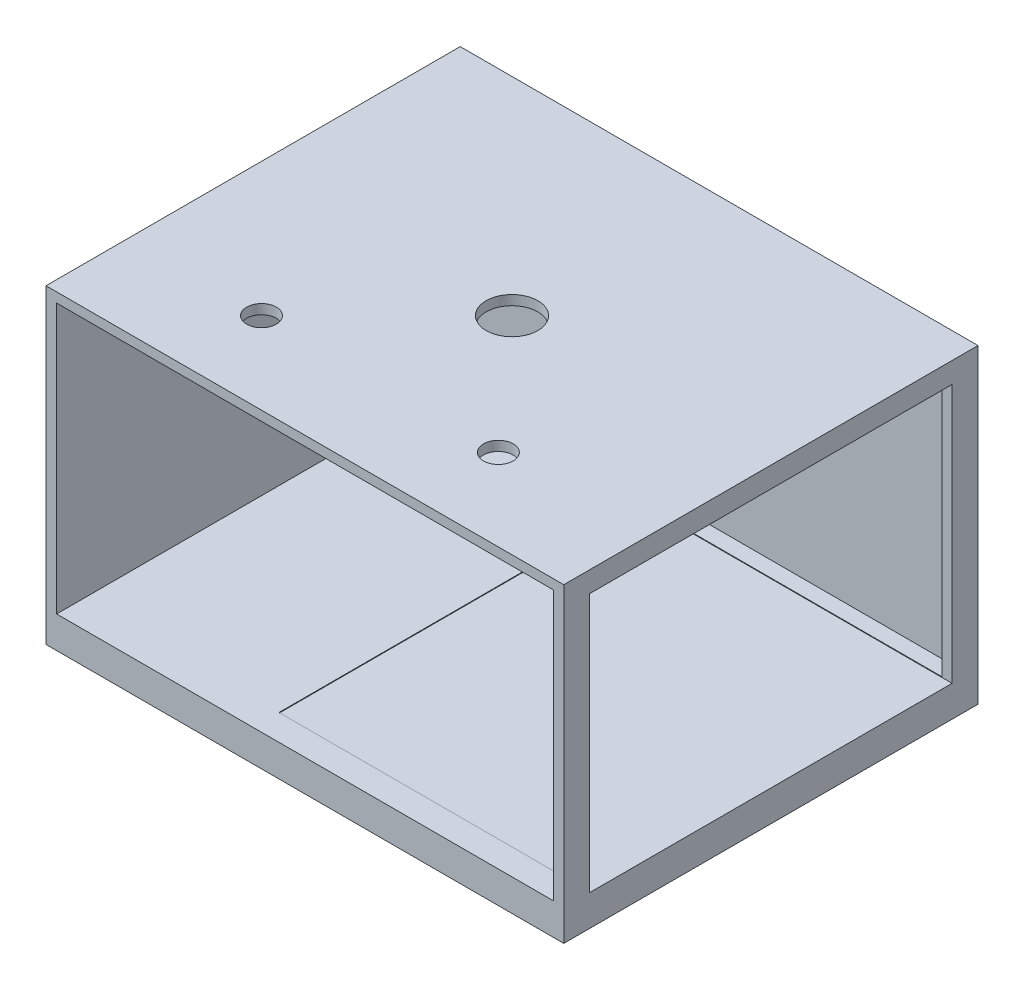
ISO-10303-21;
HEADER;
FILE_DESCRIPTION(('STEP AP214'),'2;1');
FILE_NAME('part.step','',(''),(''),'','','');
FILE_SCHEMA(('AUTOMOTIVE_DESIGN { 1 0 10303 214 1 1 1 1 }'));
ENDSEC;
DATA;
#1=APPLICATION_CONTEXT('core data for automotive mechanical design processes');
#2=APPLICATION_PROTOCOL_DEFINITION('international standard','automotive_design',2000,#1);
#3=PRODUCT_CONTEXT('',#1,'mechanical');
#4=PRODUCT('Part','Part','',(#3));
#5=PRODUCT_RELATED_PRODUCT_CATEGORY('part','',(#4));
#6=PRODUCT_DEFINITION_FORMATION('','',#4);
#7=PRODUCT_DEFINITION_CONTEXT('part definition',#1,'design');
#8=PRODUCT_DEFINITION('design','',#6,#7);
#9=PRODUCT_DEFINITION_SHAPE('','',#8);
#10=(LENGTH_UNIT() NAMED_UNIT(*) SI_UNIT(.MILLI.,.METRE.));
#11=(NAMED_UNIT(*) PLANE_ANGLE_UNIT() SI_UNIT($,.RADIAN.));
#12=(NAMED_UNIT(*) SI_UNIT($,.STERADIAN.) SOLID_ANGLE_UNIT());
#13=UNCERTAINTY_MEASURE_WITH_UNIT(LENGTH_MEASURE(1.E-05),#10,'distance_accuracy_value','');
#14=(GEOMETRIC_REPRESENTATION_CONTEXT(3) GLOBAL_UNCERTAINTY_ASSIGNED_CONTEXT((#13)) GLOBAL_UNIT_ASSIGNED_CONTEXT((#10,
#11,#12)) REPRESENTATION_CONTEXT('',''));
#15=CARTESIAN_POINT('',(0.,0.,0.));
#16=DIRECTION('',(0.,0.,1.));
#17=DIRECTION('',(1.,0.,0.));
#18=AXIS2_PLACEMENT_3D('',#15,#16,#17);
#19=CARTESIAN_POINT('',(240.261055225084,280.,200.));
#20=DIRECTION('',(0.,-1.,0.));
#21=DIRECTION('',(0.,0.,-1.));
#22=AXIS2_PLACEMENT_3D('',#19,#20,#21);
#23=PLANE('',#22);
#24=DIRECTION('',(1.,0.,0.));
#25=VECTOR('',#24,1.);
#26=CARTESIAN_POINT('',(250.,280.,175.));
#27=LINE('',#26,#25);
#28=CARTESIAN_POINT('',(240.261055225084,280.,175.));
#29=VERTEX_POINT('',#28);
#30=CARTESIAN_POINT('',(250.,280.,175.));
#31=VERTEX_POINT('',#30);
#32=EDGE_CURVE('E52',#29,#31,#27,.T.);
#33=ORIENTED_EDGE('',*,*,#32,.F.);
#34=DIRECTION('',(0.,0.,-1.));
#35=VECTOR('',#34,1.);
#36=CARTESIAN_POINT('',(240.261055225084,280.,200.));
#37=LINE('',#36,#35);
#38=CARTESIAN_POINT('',(240.261055225084,280.,-175.));
#39=VERTEX_POINT('',#38);
#40=EDGE_CURVE('E45',#29,#39,#37,.T.);
#41=ORIENTED_EDGE('',*,*,#40,.T.);
#42=DIRECTION('',(1.,0.,0.));
#43=VECTOR('',#42,1.);
#44=CARTESIAN_POINT('',(240.261055225084,280.,-175.));
#45=LINE('',#44,#43);
#46=CARTESIAN_POINT('',(250.,280.,-175.));
#47=VERTEX_POINT('',#46);
#48=EDGE_CURVE('E11',#39,#47,#45,.T.);
#49=ORIENTED_EDGE('',*,*,#48,.T.);
#50=DIRECTION('',(0.,0.,-1.));
#51=VECTOR('',#50,1.);
#52=CARTESIAN_POINT('',(250.,280.,200.));
#53=LINE('',#52,#51);
#54=EDGE_CURVE('E253',#31,#47,#53,.T.);
#55=ORIENTED_EDGE('',*,*,#54,.F.);
#56=EDGE_LOOP('',(#33,#41,#49,#55));
#57=FACE_BOUND('',#56,.T.);
#58=ADVANCED_FACE('F37',(#57),#23,.T.);
#59=CARTESIAN_POINT('',(240.261055225084,290.632083078125,200.));
#60=DIRECTION('',(0.,0.,1.));
#61=DIRECTION('',(1.,0.,0.));
#62=AXIS2_PLACEMENT_3D('',#59,#60,#61);
#63=PLANE('',#62);
#64=DIRECTION('',(0.,1.,0.));
#65=VECTOR('',#64,1.);
#66=CARTESIAN_POINT('',(-239.738944774916,290.632083078125,200.));
#67=LINE('',#66,#65);
#68=CARTESIAN_POINT('',(-239.738944774916,30.6320830781249,200.));
#69=VERTEX_POINT('',#68);
#70=CARTESIAN_POINT('',(-239.738944774916,290.632083078125,200.));
#71=VERTEX_POINT('',#70);
#72=EDGE_CURVE('E188',#69,#71,#67,.T.);
#73=ORIENTED_EDGE('',*,*,#72,.T.);
#74=DIRECTION('',(1.,0.,0.));
#75=VECTOR('',#74,1.);
#76=CARTESIAN_POINT('',(250.,290.632083078125,200.));
#77=LINE('',#76,#75);
#78=CARTESIAN_POINT('',(240.261055225084,290.632083078125,200.));
#79=VERTEX_POINT('',#78);
#80=EDGE_CURVE('E151',#71,#79,#77,.T.);
#81=ORIENTED_EDGE('',*,*,#80,.T.);
#82=DIRECTION('',(0.,-1.,0.));
#83=VECTOR('',#82,1.);
#84=CARTESIAN_POINT('',(240.261055225084,290.632083078125,200.));
#85=LINE('',#84,#83);
#86=CARTESIAN_POINT('',(240.261055225084,30.6320830781249,200.));
#87=VERTEX_POINT('',#86);
#88=EDGE_CURVE('E61',#79,#87,#85,.T.);
#89=ORIENTED_EDGE('',*,*,#88,.T.);
#90=DIRECTION('',(-1.,0.,0.));
#91=VECTOR('',#90,1.);
#92=CARTESIAN_POINT('',(-239.738944774916,30.6320830781249,200.));
#93=LINE('',#92,#91);
#94=EDGE_CURVE('E231',#87,#69,#93,.T.);
#95=ORIENTED_EDGE('',*,*,#94,.T.);
#96=EDGE_LOOP('',(#73,#81,#89,#95));
#97=FACE_BOUND('',#96,.T.);
#98=DIRECTION('',(0.,-1.,0.));
#99=VECTOR('',#98,1.);
#100=CARTESIAN_POINT('',(250.,290.632083078125,200.));
#101=LINE('',#100,#99);
#102=CARTESIAN_POINT('',(250.,300.,200.));
#103=VERTEX_POINT('',#102);
#104=CARTESIAN_POINT('',(250.,0.,200.));
#105=VERTEX_POINT('',#104);
#106=EDGE_CURVE('E251',#103,#105,#101,.T.);
#107=ORIENTED_EDGE('',*,*,#106,.F.);
#108=DIRECTION('',(1.,0.,0.));
#109=VECTOR('',#108,1.);
#110=CARTESIAN_POINT('',(250.,300.,200.));
#111=LINE('',#110,#109);
#112=CARTESIAN_POINT('',(-250.,300.,200.));
#113=VERTEX_POINT('',#112);
#114=EDGE_CURVE('E182',#113,#103,#111,.T.);
#115=ORIENTED_EDGE('',*,*,#114,.F.);
#116=DIRECTION('',(0.,1.,0.));
#117=VECTOR('',#116,1.);
#118=CARTESIAN_POINT('',(-250.,290.632083078125,200.));
#119=LINE('',#118,#117);
#120=CARTESIAN_POINT('',(-250.,0.,200.));
#121=VERTEX_POINT('',#120);
#122=EDGE_CURVE('E197',#121,#113,#119,.T.);
#123=ORIENTED_EDGE('',*,*,#122,.F.);
#124=DIRECTION('',(-1.,0.,0.));
#125=VECTOR('',#124,1.);
#126=CARTESIAN_POINT('',(-239.738944774916,0.,200.));
#127=LINE('',#126,#125);
#128=EDGE_CURVE('E213',#105,#121,#127,.T.);
#129=ORIENTED_EDGE('',*,*,#128,.F.);
#130=EDGE_LOOP('',(#107,#115,#123,#129));
#131=FACE_BOUND('',#130,.T.);
#132=ADVANCED_FACE('F39',(#97,#131),#63,.T.);
#133=CARTESIAN_POINT('',(240.261055225084,0.,0.));
#134=DIRECTION('',(1.,0.,0.));
#135=DIRECTION('',(0.,0.,-1.));
#136=AXIS2_PLACEMENT_3D('',#133,#134,#135);
#137=PLANE('',#136);
#138=DIRECTION('',(0.,0.,1.));
#139=VECTOR('',#138,1.);
#140=CARTESIAN_POINT('',(240.261055225084,290.632083078125,-175.));
#141=LINE('',#140,#139);
#142=CARTESIAN_POINT('',(240.261055225084,290.632083078125,-190.));
#143=VERTEX_POINT('',#142);
#144=EDGE_CURVE('E158',#143,#79,#141,.T.);
#145=ORIENTED_EDGE('',*,*,#144,.F.);
#146=DIRECTION('',(0.,1.,0.));
#147=VECTOR('',#146,1.);
#148=CARTESIAN_POINT('',(240.261055225084,30.6320830781249,-190.));
#149=LINE('',#148,#147);
#150=CARTESIAN_POINT('',(240.261055225084,30.6320830781249,-190.));
#151=VERTEX_POINT('',#150);
#152=EDGE_CURVE('E155',#151,#143,#149,.T.);
#153=ORIENTED_EDGE('',*,*,#152,.F.);
#154=DIRECTION('',(0.,0.,1.));
#155=VECTOR('',#154,1.);
#156=CARTESIAN_POINT('',(240.261055225084,30.6320830781249,-190.));
#157=LINE('',#156,#155);
#158=CARTESIAN_POINT('',(240.261055225084,30.6320830781249,-175.));
#159=VERTEX_POINT('',#158);
#160=EDGE_CURVE('E139',#151,#159,#157,.T.);
#161=ORIENTED_EDGE('',*,*,#160,.T.);
#162=DIRECTION('',(0.,1.,0.));
#163=VECTOR('',#162,1.);
#164=CARTESIAN_POINT('',(240.261055225084,30.6320830781249,-175.));
#165=LINE('',#164,#163);
#166=EDGE_CURVE('E166',#159,#39,#165,.T.);
#167=ORIENTED_EDGE('',*,*,#166,.T.);
#168=ORIENTED_EDGE('',*,*,#40,.F.);
#169=DIRECTION('',(0.,1.,0.));
#170=VECTOR('',#169,1.);
#171=CARTESIAN_POINT('',(240.261055225084,30.6320830781249,175.));
#172=LINE('',#171,#170);
#173=CARTESIAN_POINT('',(240.261055225084,30.6320830781249,175.));
#174=VERTEX_POINT('',#173);
#175=EDGE_CURVE('E248',#174,#29,#172,.T.);
#176=ORIENTED_EDGE('',*,*,#175,.F.);
#177=DIRECTION('',(0.,0.,-1.));
#178=VECTOR('',#177,1.);
#179=CARTESIAN_POINT('',(240.261055225084,30.6320830781249,175.));
#180=LINE('',#179,#178);
#181=EDGE_CURVE('E241',#87,#174,#180,.T.);
#182=ORIENTED_EDGE('',*,*,#181,.F.);
#183=ORIENTED_EDGE('',*,*,#88,.F.);
#184=EDGE_LOOP('',(#145,#153,#161,#167,#168,#176,#182,#183));
#185=FACE_BOUND('',#184,.T.);
#186=ADVANCED_FACE('F156',(#185),#137,.F.);
#187=CARTESIAN_POINT('',(250.,0.,0.));
#188=DIRECTION('',(1.,0.,0.));
#189=DIRECTION('',(0.,0.,-1.));
#190=AXIS2_PLACEMENT_3D('',#187,#188,#189);
#191=PLANE('',#190);
#192=DIRECTION('',(0.,-1.,0.));
#193=VECTOR('',#192,1.);
#194=CARTESIAN_POINT('',(250.,0.,-200.));
#195=LINE('',#194,#193);
#196=CARTESIAN_POINT('',(250.,300.,-200.));
#197=VERTEX_POINT('',#196);
#198=CARTESIAN_POINT('',(250.,0.,-200.));
#199=VERTEX_POINT('',#198);
#200=EDGE_CURVE('E202',#197,#199,#195,.T.);
#201=ORIENTED_EDGE('',*,*,#200,.F.);
#202=DIRECTION('',(0.,0.,-1.));
#203=VECTOR('',#202,1.);
#204=CARTESIAN_POINT('',(250.,300.,-200.));
#205=LINE('',#204,#203);
#206=EDGE_CURVE('E185',#103,#197,#205,.T.);
#207=ORIENTED_EDGE('',*,*,#206,.F.);
#208=ORIENTED_EDGE('',*,*,#106,.T.);
#209=DIRECTION('',(0.,0.,1.));
#210=VECTOR('',#209,1.);
#211=CARTESIAN_POINT('',(250.,0.,200.));
#212=LINE('',#211,#210);
#213=EDGE_CURVE('E210',#199,#105,#212,.T.);
#214=ORIENTED_EDGE('',*,*,#213,.F.);
#215=EDGE_LOOP('',(#201,#207,#208,#214));
#216=FACE_BOUND('',#215,.T.);
#217=ORIENTED_EDGE('',*,*,#54,.T.);
#218=DIRECTION('',(0.,-1.,0.));
#219=VECTOR('',#218,1.);
#220=CARTESIAN_POINT('',(250.,0.,-175.));
#221=LINE('',#220,#219);
#222=CARTESIAN_POINT('',(250.,30.,-175.));
#223=VERTEX_POINT('',#222);
#224=EDGE_CURVE('E199',#47,#223,#221,.T.);
#225=ORIENTED_EDGE('',*,*,#224,.T.);
#226=DIRECTION('',(0.,0.,1.));
#227=VECTOR('',#226,1.);
#228=CARTESIAN_POINT('',(250.,30.,200.));
#229=LINE('',#228,#227);
#230=CARTESIAN_POINT('',(250.,30.,175.));
#231=VERTEX_POINT('',#230);
#232=EDGE_CURVE('E214',#223,#231,#229,.T.);
#233=ORIENTED_EDGE('',*,*,#232,.T.);
#234=DIRECTION('',(0.,1.,0.));
#235=VECTOR('',#234,1.);
#236=CARTESIAN_POINT('',(250.,30.6320830781249,175.));
#237=LINE('',#236,#235);
#238=EDGE_CURVE('E244',#231,#31,#237,.T.);
#239=ORIENTED_EDGE('',*,*,#238,.T.);
#240=EDGE_LOOP('',(#217,#225,#233,#239));
#241=FACE_BOUND('',#240,.T.);
#242=ADVANCED_FACE('F258',(#216,#241),#191,.T.);
#243=CARTESIAN_POINT('',(250.,30.6320830781249,175.));
#244=DIRECTION('',(0.,0.,1.));
#245=DIRECTION('',(1.,0.,0.));
#246=AXIS2_PLACEMENT_3D('',#243,#244,#245);
#247=PLANE('',#246);
#248=ORIENTED_EDGE('',*,*,#32,.T.);
#249=ORIENTED_EDGE('',*,*,#238,.F.);
#250=DIRECTION('',(1.,0.,0.));
#251=VECTOR('',#250,1.);
#252=CARTESIAN_POINT('',(250.,30.,175.));
#253=LINE('',#252,#251);
#254=CARTESIAN_POINT('',(-50.,30.,175.));
#255=VERTEX_POINT('',#254);
#256=EDGE_CURVE('E221',#255,#231,#253,.T.);
#257=ORIENTED_EDGE('',*,*,#256,.F.);
#258=DIRECTION('',(0.,1.,0.));
#259=VECTOR('',#258,1.);
#260=CARTESIAN_POINT('',(-50.,30.,175.));
#261=LINE('',#260,#259);
#262=CARTESIAN_POINT('',(-50.,30.6320830781249,175.));
#263=VERTEX_POINT('',#262);
#264=EDGE_CURVE('E228',#255,#263,#261,.T.);
#265=ORIENTED_EDGE('',*,*,#264,.T.);
#266=DIRECTION('',(1.,0.,0.));
#267=VECTOR('',#266,1.);
#268=CARTESIAN_POINT('',(250.,30.6320830781249,175.));
#269=LINE('',#268,#267);
#270=EDGE_CURVE('E216',#263,#174,#269,.T.);
#271=ORIENTED_EDGE('',*,*,#270,.T.);
#272=ORIENTED_EDGE('',*,*,#175,.T.);
#273=EDGE_LOOP('',(#248,#249,#257,#265,#271,#272));
#274=FACE_BOUND('',#273,.T.);
#275=ADVANCED_FACE('F268',(#274),#247,.F.);
#276=CARTESIAN_POINT('',(0.,30.6320830781249,0.));
#277=DIRECTION('',(0.,-1.,0.));
#278=DIRECTION('',(0.,0.,-1.));
#279=AXIS2_PLACEMENT_3D('',#276,#277,#278);
#280=PLANE('',#279);
#281=ORIENTED_EDGE('',*,*,#94,.F.);
#282=ORIENTED_EDGE('',*,*,#181,.T.);
#283=ORIENTED_EDGE('',*,*,#270,.F.);
#284=DIRECTION('',(0.,0.,1.));
#285=VECTOR('',#284,1.);
#286=CARTESIAN_POINT('',(-50.,30.6320830781249,175.));
#287=LINE('',#286,#285);
#288=CARTESIAN_POINT('',(-50.,30.6320830781249,-175.));
#289=VERTEX_POINT('',#288);
#290=EDGE_CURVE('E225',#289,#263,#287,.T.);
#291=ORIENTED_EDGE('',*,*,#290,.F.);
#292=DIRECTION('',(1.,0.,0.));
#293=VECTOR('',#292,1.);
#294=CARTESIAN_POINT('',(-239.738944774916,30.6320830781249,-175.));
#295=LINE('',#294,#293);
#296=EDGE_CURVE('E148',#289,#159,#295,.T.);
#297=ORIENTED_EDGE('',*,*,#296,.T.);
#298=ORIENTED_EDGE('',*,*,#160,.F.);
#299=DIRECTION('',(1.,0.,0.));
#300=VECTOR('',#299,1.);
#301=CARTESIAN_POINT('',(-239.738944774916,30.6320830781249,-190.));
#302=LINE('',#301,#300);
#303=CARTESIAN_POINT('',(-239.738944774916,30.6320830781249,-190.));
#304=VERTEX_POINT('',#303);
#305=EDGE_CURVE('E145',#304,#151,#302,.T.);
#306=ORIENTED_EDGE('',*,*,#305,.F.);
#307=DIRECTION('',(0.,0.,-1.));
#308=VECTOR('',#307,1.);
#309=CARTESIAN_POINT('',(-239.738944774916,30.6320830781249,-175.));
#310=LINE('',#309,#308);
#311=EDGE_CURVE('E233',#69,#304,#310,.T.);
#312=ORIENTED_EDGE('',*,*,#311,.F.);
#313=EDGE_LOOP('',(#281,#282,#283,#291,#297,#298,#306,#312));
#314=FACE_BOUND('',#313,.T.);
#315=ADVANCED_FACE('F142',(#314),#280,.F.);
#316=CARTESIAN_POINT('',(-50.,30.,175.));
#317=DIRECTION('',(-1.,0.,0.));
#318=DIRECTION('',(0.,0.,1.));
#319=AXIS2_PLACEMENT_3D('',#316,#317,#318);
#320=PLANE('',#319);
#321=ORIENTED_EDGE('',*,*,#290,.T.);
#322=ORIENTED_EDGE('',*,*,#264,.F.);
#323=DIRECTION('',(0.,0.,1.));
#324=VECTOR('',#323,1.);
#325=CARTESIAN_POINT('',(-50.,30.,175.));
#326=LINE('',#325,#324);
#327=CARTESIAN_POINT('',(-50.,30.,-175.));
#328=VERTEX_POINT('',#327);
#329=EDGE_CURVE('E224',#328,#255,#326,.T.);
#330=ORIENTED_EDGE('',*,*,#329,.F.);
#331=DIRECTION('',(0.,1.,0.));
#332=VECTOR('',#331,1.);
#333=CARTESIAN_POINT('',(-50.,30.,-175.));
#334=LINE('',#333,#332);
#335=EDGE_CURVE('E238',#328,#289,#334,.T.);
#336=ORIENTED_EDGE('',*,*,#335,.T.);
#337=EDGE_LOOP('',(#321,#322,#330,#336));
#338=FACE_BOUND('',#337,.T.);
#339=ADVANCED_FACE('F271',(#338),#320,.F.);
#340=CARTESIAN_POINT('',(0.,0.,0.));
#341=DIRECTION('',(0.,1.,0.));
#342=DIRECTION('',(0.,0.,1.));
#343=AXIS2_PLACEMENT_3D('',#340,#341,#342);
#344=PLANE('',#343);
#345=ORIENTED_EDGE('',*,*,#128,.T.);
#346=DIRECTION('',(0.,0.,1.));
#347=VECTOR('',#346,1.);
#348=CARTESIAN_POINT('',(-250.,0.,200.));
#349=LINE('',#348,#347);
#350=CARTESIAN_POINT('',(-250.,0.,-200.));
#351=VERTEX_POINT('',#350);
#352=EDGE_CURVE('E193',#351,#121,#349,.T.);
#353=ORIENTED_EDGE('',*,*,#352,.F.);
#354=DIRECTION('',(-1.,0.,0.));
#355=VECTOR('',#354,1.);
#356=CARTESIAN_POINT('',(-239.738944774916,0.,-200.));
#357=LINE('',#356,#355);
#358=EDGE_CURVE('E205',#199,#351,#357,.T.);
#359=ORIENTED_EDGE('',*,*,#358,.F.);
#360=ORIENTED_EDGE('',*,*,#213,.T.);
#361=EDGE_LOOP('',(#345,#353,#359,#360));
#362=FACE_BOUND('',#361,.T.);
#363=ADVANCED_FACE('F309',(#362),#344,.F.);
#364=CARTESIAN_POINT('',(0.,30.,0.));
#365=DIRECTION('',(0.,1.,0.));
#366=DIRECTION('',(0.,0.,1.));
#367=AXIS2_PLACEMENT_3D('',#364,#365,#366);
#368=PLANE('',#367);
#369=ORIENTED_EDGE('',*,*,#329,.T.);
#370=ORIENTED_EDGE('',*,*,#256,.T.);
#371=ORIENTED_EDGE('',*,*,#232,.F.);
#372=DIRECTION('',(1.,0.,0.));
#373=VECTOR('',#372,1.);
#374=CARTESIAN_POINT('',(250.,30.,-175.));
#375=LINE('',#374,#373);
#376=EDGE_CURVE('E207',#328,#223,#375,.T.);
#377=ORIENTED_EDGE('',*,*,#376,.F.);
#378=EDGE_LOOP('',(#369,#370,#371,#377));
#379=FACE_BOUND('',#378,.T.);
#380=ADVANCED_FACE('F265',(#379),#368,.T.);
#381=CARTESIAN_POINT('',(0.,0.,-175.));
#382=DIRECTION('',(0.,0.,1.));
#383=DIRECTION('',(1.,0.,0.));
#384=AXIS2_PLACEMENT_3D('',#381,#382,#383);
#385=PLANE('',#384);
#386=ORIENTED_EDGE('',*,*,#296,.F.);
#387=ORIENTED_EDGE('',*,*,#335,.F.);
#388=ORIENTED_EDGE('',*,*,#376,.T.);
#389=ORIENTED_EDGE('',*,*,#224,.F.);
#390=ORIENTED_EDGE('',*,*,#48,.F.);
#391=ORIENTED_EDGE('',*,*,#166,.F.);
#392=EDGE_LOOP('',(#386,#387,#388,#389,#390,#391));
#393=FACE_BOUND('',#392,.T.);
#394=ADVANCED_FACE('F261',(#393),#385,.T.);
#395=CARTESIAN_POINT('',(0.,0.,-200.));
#396=DIRECTION('',(0.,0.,1.));
#397=DIRECTION('',(1.,0.,0.));
#398=AXIS2_PLACEMENT_3D('',#395,#396,#397);
#399=PLANE('',#398);
#400=ORIENTED_EDGE('',*,*,#358,.T.);
#401=DIRECTION('',(0.,-1.,0.));
#402=VECTOR('',#401,1.);
#403=CARTESIAN_POINT('',(-250.,0.,-200.));
#404=LINE('',#403,#402);
#405=CARTESIAN_POINT('',(-250.,300.,-200.));
#406=VERTEX_POINT('',#405);
#407=EDGE_CURVE('E190',#406,#351,#404,.T.);
#408=ORIENTED_EDGE('',*,*,#407,.F.);
#409=DIRECTION('',(-1.,0.,0.));
#410=VECTOR('',#409,1.);
#411=CARTESIAN_POINT('',(-250.,300.,-200.));
#412=LINE('',#411,#410);
#413=EDGE_CURVE('E176',#197,#406,#412,.T.);
#414=ORIENTED_EDGE('',*,*,#413,.F.);
#415=ORIENTED_EDGE('',*,*,#200,.T.);
#416=EDGE_LOOP('',(#400,#408,#414,#415));
#417=FACE_BOUND('',#416,.T.);
#418=ADVANCED_FACE('F319',(#417),#399,.F.);
#419=CARTESIAN_POINT('',(-250.,0.,0.));
#420=DIRECTION('',(1.,0.,0.));
#421=DIRECTION('',(0.,0.,-1.));
#422=AXIS2_PLACEMENT_3D('',#419,#420,#421);
#423=PLANE('',#422);
#424=ORIENTED_EDGE('',*,*,#407,.T.);
#425=ORIENTED_EDGE('',*,*,#352,.T.);
#426=ORIENTED_EDGE('',*,*,#122,.T.);
#427=DIRECTION('',(0.,0.,1.));
#428=VECTOR('',#427,1.);
#429=CARTESIAN_POINT('',(-250.,300.,200.));
#430=LINE('',#429,#428);
#431=EDGE_CURVE('E179',#406,#113,#430,.T.);
#432=ORIENTED_EDGE('',*,*,#431,.F.);
#433=EDGE_LOOP('',(#424,#425,#426,#432));
#434=FACE_BOUND('',#433,.T.);
#435=ADVANCED_FACE('F322',(#434),#423,.F.);
#436=CARTESIAN_POINT('',(-239.738944774916,0.,0.));
#437=DIRECTION('',(1.,0.,0.));
#438=DIRECTION('',(0.,0.,-1.));
#439=AXIS2_PLACEMENT_3D('',#436,#437,#438);
#440=PLANE('',#439);
#441=ORIENTED_EDGE('',*,*,#72,.F.);
#442=ORIENTED_EDGE('',*,*,#311,.T.);
#443=DIRECTION('',(0.,-1.,0.));
#444=VECTOR('',#443,1.);
#445=CARTESIAN_POINT('',(-239.738944774916,290.632083078125,-190.));
#446=LINE('',#445,#444);
#447=CARTESIAN_POINT('',(-239.738944774916,290.632083078125,-190.));
#448=VERTEX_POINT('',#447);
#449=EDGE_CURVE('E152',#448,#304,#446,.T.);
#450=ORIENTED_EDGE('',*,*,#449,.F.);
#451=DIRECTION('',(0.,0.,-1.));
#452=VECTOR('',#451,1.);
#453=CARTESIAN_POINT('',(-239.738944774916,290.632083078125,-200.));
#454=LINE('',#453,#452);
#455=EDGE_CURVE('E194',#71,#448,#454,.T.);
#456=ORIENTED_EDGE('',*,*,#455,.F.);
#457=EDGE_LOOP('',(#441,#442,#450,#456));
#458=FACE_BOUND('',#457,.T.);
#459=ADVANCED_FACE('F277',(#458),#440,.T.);
#460=CARTESIAN_POINT('',(0.,300.,0.));
#461=DIRECTION('',(0.,-1.,0.));
#462=DIRECTION('',(0.,0.,-1.));
#463=AXIS2_PLACEMENT_3D('',#460,#461,#462);
#464=PLANE('',#463);
#465=CARTESIAN_POINT('',(0.,300.,0.));
#466=DIRECTION('',(0.,-1.,0.));
#467=DIRECTION('',(0.,0.,-1.));
#468=AXIS2_PLACEMENT_3D('',#465,#466,#467);
#469=CIRCLE('',#468,25.);
#470=CARTESIAN_POINT('',(0.,300.,-25.));
#471=VERTEX_POINT('',#470);
#472=EDGE_CURVE('E407',#471,#471,#469,.T.);
#473=ORIENTED_EDGE('',*,*,#472,.T.);
#474=EDGE_LOOP('',(#473));
#475=FACE_BOUND('',#474,.T.);
#476=CARTESIAN_POINT('',(107.763649024758,300.,120.947499703318));
#477=DIRECTION('',(0.,-1.,0.));
#478=DIRECTION('',(0.,0.,-1.));
#479=AXIS2_PLACEMENT_3D('',#476,#477,#478);
#480=CIRCLE('',#479,14.3302724766965);
#481=CARTESIAN_POINT('',(107.763649024758,300.,106.617227226621));
#482=VERTEX_POINT('',#481);
#483=EDGE_CURVE('E400',#482,#482,#480,.T.);
#484=ORIENTED_EDGE('',*,*,#483,.T.);
#485=EDGE_LOOP('',(#484));
#486=FACE_BOUND('',#485,.T.);
#487=CARTESIAN_POINT('',(-120.947499703319,300.,120.947499703318));
#488=DIRECTION('',(0.,-1.,0.));
#489=DIRECTION('',(0.,0.,-1.));
#490=AXIS2_PLACEMENT_3D('',#487,#488,#489);
#491=CIRCLE('',#490,14.3302724766965);
#492=CARTESIAN_POINT('',(-120.947499703319,300.,106.617227226621));
#493=VERTEX_POINT('',#492);
#494=EDGE_CURVE('E170',#493,#493,#491,.T.);
#495=ORIENTED_EDGE('',*,*,#494,.T.);
#496=EDGE_LOOP('',(#495));
#497=FACE_BOUND('',#496,.T.);
#498=ORIENTED_EDGE('',*,*,#413,.T.);
#499=ORIENTED_EDGE('',*,*,#431,.T.);
#500=ORIENTED_EDGE('',*,*,#114,.T.);
#501=ORIENTED_EDGE('',*,*,#206,.T.);
#502=EDGE_LOOP('',(#498,#499,#500,#501));
#503=FACE_BOUND('',#502,.T.);
#504=ADVANCED_FACE('F281',(#475,#486,#497,#503),#464,.F.);
#505=CARTESIAN_POINT('',(0.,290.632083078125,0.));
#506=DIRECTION('',(0.,-1.,0.));
#507=DIRECTION('',(0.,0.,-1.));
#508=AXIS2_PLACEMENT_3D('',#505,#506,#507);
#509=PLANE('',#508);
#510=CARTESIAN_POINT('',(0.,290.632083078125,0.));
#511=DIRECTION('',(0.,-1.,0.));
#512=DIRECTION('',(0.,0.,-1.));
#513=AXIS2_PLACEMENT_3D('',#510,#511,#512);
#514=CIRCLE('',#513,25.);
#515=CARTESIAN_POINT('',(0.,290.632083078125,-25.));
#516=VERTEX_POINT('',#515);
#517=EDGE_CURVE('E410',#516,#516,#514,.T.);
#518=ORIENTED_EDGE('',*,*,#517,.F.);
#519=EDGE_LOOP('',(#518));
#520=FACE_BOUND('',#519,.T.);
#521=CARTESIAN_POINT('',(107.763649024758,290.632083078125,120.947499703318));
#522=DIRECTION('',(0.,-1.,0.));
#523=DIRECTION('',(0.,0.,-1.));
#524=AXIS2_PLACEMENT_3D('',#521,#522,#523);
#525=CIRCLE('',#524,14.3302724766965);
#526=CARTESIAN_POINT('',(107.763649024758,290.632083078125,106.617227226621));
#527=VERTEX_POINT('',#526);
#528=EDGE_CURVE('E402',#527,#527,#525,.T.);
#529=ORIENTED_EDGE('',*,*,#528,.F.);
#530=EDGE_LOOP('',(#529));
#531=FACE_BOUND('',#530,.T.);
#532=CARTESIAN_POINT('',(-120.947499703319,290.632083078125,120.947499703318));
#533=DIRECTION('',(0.,-1.,0.));
#534=DIRECTION('',(0.,0.,-1.));
#535=AXIS2_PLACEMENT_3D('',#532,#533,#534);
#536=CIRCLE('',#535,14.3302724766965);
#537=CARTESIAN_POINT('',(-120.947499703319,290.632083078125,106.617227226621));
#538=VERTEX_POINT('',#537);
#539=EDGE_CURVE('E398',#538,#538,#536,.T.);
#540=ORIENTED_EDGE('',*,*,#539,.F.);
#541=EDGE_LOOP('',(#540));
#542=FACE_BOUND('',#541,.T.);
#543=ORIENTED_EDGE('',*,*,#80,.F.);
#544=ORIENTED_EDGE('',*,*,#455,.T.);
#545=DIRECTION('',(-1.,0.,0.));
#546=VECTOR('',#545,1.);
#547=CARTESIAN_POINT('',(240.261055225084,290.632083078125,-190.));
#548=LINE('',#547,#546);
#549=EDGE_CURVE('E162',#143,#448,#548,.T.);
#550=ORIENTED_EDGE('',*,*,#549,.F.);
#551=ORIENTED_EDGE('',*,*,#144,.T.);
#552=EDGE_LOOP('',(#543,#544,#550,#551));
#553=FACE_BOUND('',#552,.T.);
#554=ADVANCED_FACE('F279',(#520,#531,#542,#553),#509,.T.);
#555=CARTESIAN_POINT('',(0.,0.,-190.));
#556=DIRECTION('',(0.,0.,1.));
#557=DIRECTION('',(1.,0.,0.));
#558=AXIS2_PLACEMENT_3D('',#555,#556,#557);
#559=PLANE('',#558);
#560=ORIENTED_EDGE('',*,*,#305,.T.);
#561=ORIENTED_EDGE('',*,*,#152,.T.);
#562=ORIENTED_EDGE('',*,*,#549,.T.);
#563=ORIENTED_EDGE('',*,*,#449,.T.);
#564=EDGE_LOOP('',(#560,#561,#562,#563));
#565=FACE_BOUND('',#564,.T.);
#566=ADVANCED_FACE('F164',(#565),#559,.T.);
#567=CARTESIAN_POINT('',(-120.947499703319,290.632083078125,120.947499703318));
#568=DIRECTION('',(0.,-1.,0.));
#569=DIRECTION('',(0.,0.,-1.));
#570=AXIS2_PLACEMENT_3D('',#567,#568,#569);
#571=CYLINDRICAL_SURFACE('',#570,14.3302724766965);
#572=ORIENTED_EDGE('',*,*,#494,.F.);
#573=EDGE_LOOP('',(#572));
#574=FACE_BOUND('',#573,.T.);
#575=ORIENTED_EDGE('',*,*,#539,.T.);
#576=EDGE_LOOP('',(#575));
#577=FACE_BOUND('',#576,.T.);
#578=ADVANCED_FACE('F288',(#574,#577),#571,.F.);
#579=CARTESIAN_POINT('',(107.763649024758,290.632083078125,120.947499703318));
#580=DIRECTION('',(0.,-1.,0.));
#581=DIRECTION('',(0.,0.,-1.));
#582=AXIS2_PLACEMENT_3D('',#579,#580,#581);
#583=CYLINDRICAL_SURFACE('',#582,14.3302724766965);
#584=ORIENTED_EDGE('',*,*,#483,.F.);
#585=EDGE_LOOP('',(#584));
#586=FACE_BOUND('',#585,.T.);
#587=ORIENTED_EDGE('',*,*,#528,.T.);
#588=EDGE_LOOP('',(#587));
#589=FACE_BOUND('',#588,.T.);
#590=ADVANCED_FACE('F356',(#586,#589),#583,.F.);
#591=CARTESIAN_POINT('',(0.,290.632083078125,0.));
#592=DIRECTION('',(0.,-1.,0.));
#593=DIRECTION('',(0.,0.,-1.));
#594=AXIS2_PLACEMENT_3D('',#591,#592,#593);
#595=CYLINDRICAL_SURFACE('',#594,25.);
#596=ORIENTED_EDGE('',*,*,#472,.F.);
#597=EDGE_LOOP('',(#596));
#598=FACE_BOUND('',#597,.T.);
#599=ORIENTED_EDGE('',*,*,#517,.T.);
#600=EDGE_LOOP('',(#599));
#601=FACE_BOUND('',#600,.T.);
#602=ADVANCED_FACE('F367',(#598,#601),#595,.F.);
#603=CLOSED_SHELL('',(#58,#132,#186,#242,#275,#315,#339,#363,#380,#394,#418,#435,#459,#504,#554,
#566,#578,#590,#602));
#604=MANIFOLD_SOLID_BREP('B2',#603);
#605=ADVANCED_BREP_SHAPE_REPRESENTATION('',(#18,#604),#14);
#606=SHAPE_DEFINITION_REPRESENTATION(#9,#605);
ENDSEC;
END-ISO-10303-21;
